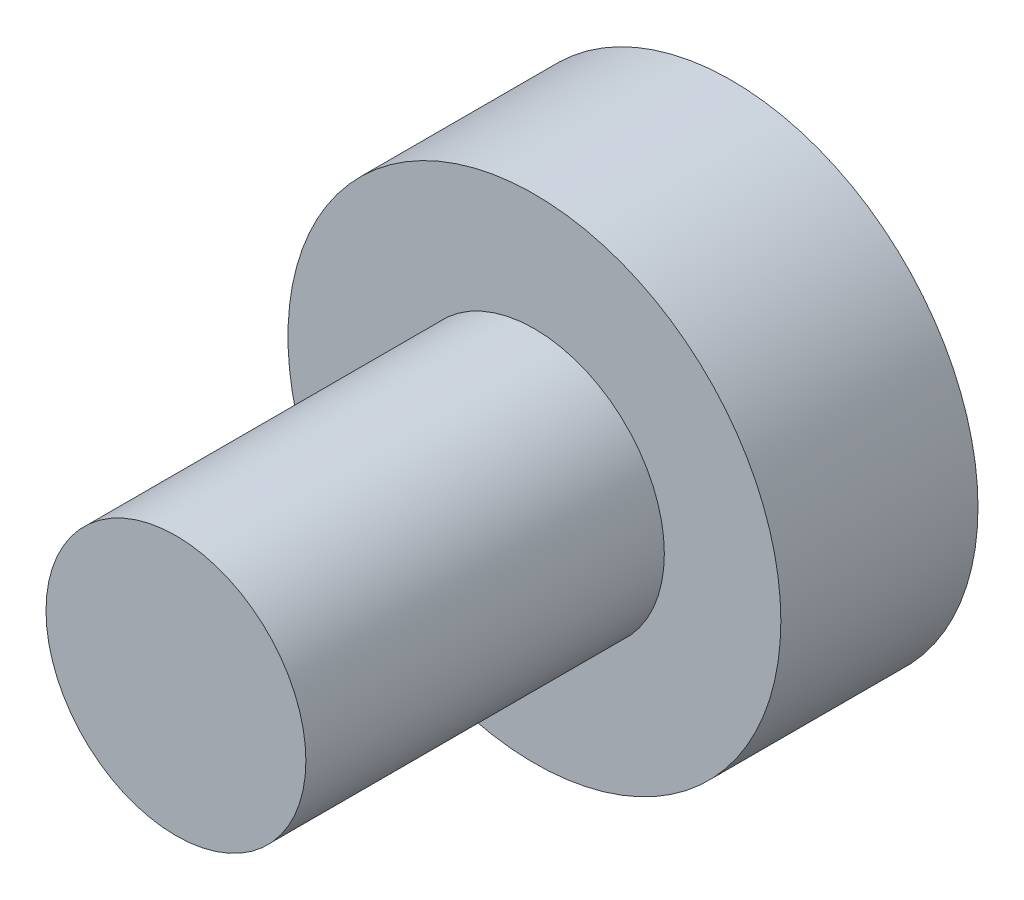
ISO-10303-21;
HEADER;
FILE_DESCRIPTION(('STEP AP214'),'2;1');
FILE_NAME('part.step','',(''),(''),'','','');
FILE_SCHEMA(('AUTOMOTIVE_DESIGN { 1 0 10303 214 1 1 1 1 }'));
ENDSEC;
DATA;
#1=APPLICATION_CONTEXT('core data for automotive mechanical design processes');
#2=APPLICATION_PROTOCOL_DEFINITION('international standard','automotive_design',2000,#1);
#3=PRODUCT_CONTEXT('',#1,'mechanical');
#4=PRODUCT('Part','Part','',(#3));
#5=PRODUCT_RELATED_PRODUCT_CATEGORY('part','',(#4));
#6=PRODUCT_DEFINITION_FORMATION('','',#4);
#7=PRODUCT_DEFINITION_CONTEXT('part definition',#1,'design');
#8=PRODUCT_DEFINITION('design','',#6,#7);
#9=PRODUCT_DEFINITION_SHAPE('','',#8);
#10=(LENGTH_UNIT() NAMED_UNIT(*) SI_UNIT(.MILLI.,.METRE.));
#11=(NAMED_UNIT(*) PLANE_ANGLE_UNIT() SI_UNIT($,.RADIAN.));
#12=(NAMED_UNIT(*) SI_UNIT($,.STERADIAN.) SOLID_ANGLE_UNIT());
#13=UNCERTAINTY_MEASURE_WITH_UNIT(LENGTH_MEASURE(1.E-05),#10,'distance_accuracy_value','');
#14=(GEOMETRIC_REPRESENTATION_CONTEXT(3) GLOBAL_UNCERTAINTY_ASSIGNED_CONTEXT((#13)) GLOBAL_UNIT_ASSIGNED_CONTEXT((#10,
#11,#12)) REPRESENTATION_CONTEXT('',''));
#15=CARTESIAN_POINT('',(0.,0.,0.));
#16=DIRECTION('',(0.,0.,1.));
#17=DIRECTION('',(1.,0.,0.));
#18=AXIS2_PLACEMENT_3D('',#15,#16,#17);
#19=CARTESIAN_POINT('',(0.,0.,0.));
#20=DIRECTION('',(0.,0.,-1.));
#21=DIRECTION('',(-1.,0.,0.));
#22=AXIS2_PLACEMENT_3D('',#19,#20,#21);
#23=CYLINDRICAL_SURFACE('',#22,2.75);
#24=CARTESIAN_POINT('',(0.,0.,0.));
#25=DIRECTION('',(0.,0.,1.));
#26=DIRECTION('',(1.,0.,0.));
#27=AXIS2_PLACEMENT_3D('',#24,#25,#26);
#28=CIRCLE('',#27,2.75);
#29=CARTESIAN_POINT('',(2.75,0.,0.));
#30=VERTEX_POINT('',#29);
#31=EDGE_CURVE('E42',#30,#30,#28,.T.);
#32=ORIENTED_EDGE('',*,*,#31,.F.);
#33=EDGE_LOOP('',(#32));
#34=FACE_BOUND('',#33,.T.);
#35=CARTESIAN_POINT('',(0.,0.,-2.2));
#36=DIRECTION('',(0.,0.,1.));
#37=DIRECTION('',(1.,0.,0.));
#38=AXIS2_PLACEMENT_3D('',#35,#36,#37);
#39=CIRCLE('',#38,2.75);
#40=CARTESIAN_POINT('',(2.75,0.,-2.2));
#41=VERTEX_POINT('',#40);
#42=EDGE_CURVE('E37',#41,#41,#39,.T.);
#43=ORIENTED_EDGE('',*,*,#42,.T.);
#44=EDGE_LOOP('',(#43));
#45=FACE_BOUND('',#44,.T.);
#46=ADVANCED_FACE('F40',(#34,#45),#23,.T.);
#47=CARTESIAN_POINT('',(0.,0.,0.));
#48=DIRECTION('',(0.,0.,1.));
#49=DIRECTION('',(1.,0.,0.));
#50=AXIS2_PLACEMENT_3D('',#47,#48,#49);
#51=PLANE('',#50);
#52=CARTESIAN_POINT('',(0.,0.,0.));
#53=DIRECTION('',(0.,0.,1.));
#54=DIRECTION('',(1.,0.,0.));
#55=AXIS2_PLACEMENT_3D('',#52,#53,#54);
#56=CIRCLE('',#55,1.45);
#57=CARTESIAN_POINT('',(1.45,0.,0.));
#58=VERTEX_POINT('',#57);
#59=EDGE_CURVE('E10',#58,#58,#56,.T.);
#60=ORIENTED_EDGE('',*,*,#59,.F.);
#61=EDGE_LOOP('',(#60));
#62=FACE_BOUND('',#61,.T.);
#63=ORIENTED_EDGE('',*,*,#31,.T.);
#64=EDGE_LOOP('',(#63));
#65=FACE_BOUND('',#64,.T.);
#66=ADVANCED_FACE('F64',(#62,#65),#51,.T.);
#67=CARTESIAN_POINT('',(0.,0.,-2.2));
#68=DIRECTION('',(0.,0.,1.));
#69=DIRECTION('',(1.,0.,0.));
#70=AXIS2_PLACEMENT_3D('',#67,#68,#69);
#71=PLANE('',#70);
#72=ORIENTED_EDGE('',*,*,#42,.F.);
#73=EDGE_LOOP('',(#72));
#74=FACE_BOUND('',#73,.T.);
#75=ADVANCED_FACE('F59',(#74),#71,.F.);
#76=CARTESIAN_POINT('',(0.,0.,4.));
#77=DIRECTION('',(0.,0.,-1.));
#78=DIRECTION('',(-1.,0.,0.));
#79=AXIS2_PLACEMENT_3D('',#76,#77,#78);
#80=CYLINDRICAL_SURFACE('',#79,1.45);
#81=CARTESIAN_POINT('',(0.,0.,4.));
#82=DIRECTION('',(0.,0.,1.));
#83=DIRECTION('',(1.,0.,0.));
#84=AXIS2_PLACEMENT_3D('',#81,#82,#83);
#85=CIRCLE('',#84,1.45);
#86=CARTESIAN_POINT('',(1.45,0.,4.));
#87=VERTEX_POINT('',#86);
#88=EDGE_CURVE('E49',#87,#87,#85,.T.);
#89=ORIENTED_EDGE('',*,*,#88,.F.);
#90=EDGE_LOOP('',(#89));
#91=FACE_BOUND('',#90,.T.);
#92=ORIENTED_EDGE('',*,*,#59,.T.);
#93=EDGE_LOOP('',(#92));
#94=FACE_BOUND('',#93,.T.);
#95=ADVANCED_FACE('F58',(#91,#94),#80,.T.);
#96=CARTESIAN_POINT('',(0.,0.,4.));
#97=DIRECTION('',(0.,0.,1.));
#98=DIRECTION('',(1.,0.,0.));
#99=AXIS2_PLACEMENT_3D('',#96,#97,#98);
#100=PLANE('',#99);
#101=ORIENTED_EDGE('',*,*,#88,.T.);
#102=EDGE_LOOP('',(#101));
#103=FACE_BOUND('',#102,.T.);
#104=ADVANCED_FACE('F67',(#103),#100,.T.);
#105=CLOSED_SHELL('',(#46,#66,#75,#95,#104));
#106=MANIFOLD_SOLID_BREP('B2',#105);
#107=ADVANCED_BREP_SHAPE_REPRESENTATION('',(#18,#106),#14);
#108=SHAPE_DEFINITION_REPRESENTATION(#9,#107);
ENDSEC;
END-ISO-10303-21;
